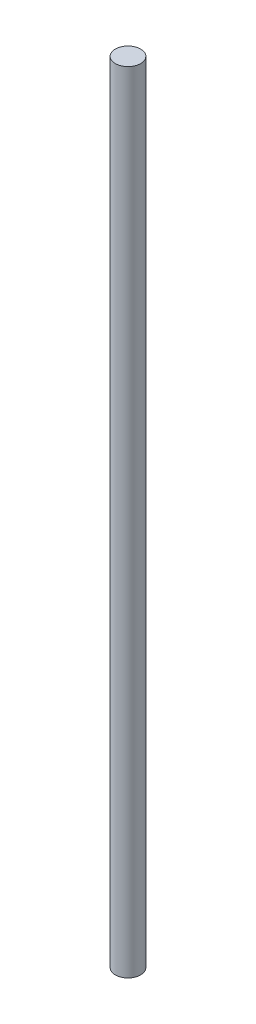
ISO-10303-21;
HEADER;
FILE_DESCRIPTION(('STEP AP214'),'2;1');
FILE_NAME('part.step','',(''),(''),'','','');
FILE_SCHEMA(('AUTOMOTIVE_DESIGN { 1 0 10303 214 1 1 1 1 }'));
ENDSEC;
DATA;
#1=APPLICATION_CONTEXT('core data for automotive mechanical design processes');
#2=APPLICATION_PROTOCOL_DEFINITION('international standard','automotive_design',2000,#1);
#3=PRODUCT_CONTEXT('',#1,'mechanical');
#4=PRODUCT('Part','Part','',(#3));
#5=PRODUCT_RELATED_PRODUCT_CATEGORY('part','',(#4));
#6=PRODUCT_DEFINITION_FORMATION('','',#4);
#7=PRODUCT_DEFINITION_CONTEXT('part definition',#1,'design');
#8=PRODUCT_DEFINITION('design','',#6,#7);
#9=PRODUCT_DEFINITION_SHAPE('','',#8);
#10=(LENGTH_UNIT() NAMED_UNIT(*) SI_UNIT(.MILLI.,.METRE.));
#11=(NAMED_UNIT(*) PLANE_ANGLE_UNIT() SI_UNIT($,.RADIAN.));
#12=(NAMED_UNIT(*) SI_UNIT($,.STERADIAN.) SOLID_ANGLE_UNIT());
#13=UNCERTAINTY_MEASURE_WITH_UNIT(LENGTH_MEASURE(1.E-05),#10,'distance_accuracy_value','');
#14=(GEOMETRIC_REPRESENTATION_CONTEXT(3) GLOBAL_UNCERTAINTY_ASSIGNED_CONTEXT((#13)) GLOBAL_UNIT_ASSIGNED_CONTEXT((#10,
#11,#12)) REPRESENTATION_CONTEXT('',''));
#15=CARTESIAN_POINT('',(0.,0.,0.));
#16=DIRECTION('',(0.,0.,1.));
#17=DIRECTION('',(1.,0.,0.));
#18=AXIS2_PLACEMENT_3D('',#15,#16,#17);
#19=CARTESIAN_POINT('',(0.,25.,0.));
#20=DIRECTION('',(0.,-1.,0.));
#21=DIRECTION('',(0.,0.,-1.));
#22=AXIS2_PLACEMENT_3D('',#19,#20,#21);
#23=CYLINDRICAL_SURFACE('',#22,0.4);
#24=CARTESIAN_POINT('',(0.,25.,0.));
#25=DIRECTION('',(0.,1.,0.));
#26=DIRECTION('',(0.,0.,1.));
#27=AXIS2_PLACEMENT_3D('',#24,#25,#26);
#28=CIRCLE('',#27,0.4);
#29=CARTESIAN_POINT('',(0.,25.,0.4));
#30=VERTEX_POINT('',#29);
#31=EDGE_CURVE('E10',#30,#30,#28,.T.);
#32=ORIENTED_EDGE('',*,*,#31,.F.);
#33=EDGE_LOOP('',(#32));
#34=FACE_BOUND('',#33,.T.);
#35=CARTESIAN_POINT('',(0.,0.,0.));
#36=DIRECTION('',(0.,1.,0.));
#37=DIRECTION('',(0.,0.,1.));
#38=AXIS2_PLACEMENT_3D('',#35,#36,#37);
#39=CIRCLE('',#38,0.4);
#40=CARTESIAN_POINT('',(0.,0.,0.4));
#41=VERTEX_POINT('',#40);
#42=EDGE_CURVE('E40',#41,#41,#39,.T.);
#43=ORIENTED_EDGE('',*,*,#42,.T.);
#44=EDGE_LOOP('',(#43));
#45=FACE_BOUND('',#44,.T.);
#46=ADVANCED_FACE('F37',(#34,#45),#23,.T.);
#47=CARTESIAN_POINT('',(0.,25.,0.));
#48=DIRECTION('',(0.,1.,0.));
#49=DIRECTION('',(0.,0.,1.));
#50=AXIS2_PLACEMENT_3D('',#47,#48,#49);
#51=PLANE('',#50);
#52=ORIENTED_EDGE('',*,*,#31,.T.);
#53=EDGE_LOOP('',(#52));
#54=FACE_BOUND('',#53,.T.);
#55=ADVANCED_FACE('F54',(#54),#51,.T.);
#56=CARTESIAN_POINT('',(0.,0.,0.));
#57=DIRECTION('',(0.,1.,0.));
#58=DIRECTION('',(0.,0.,1.));
#59=AXIS2_PLACEMENT_3D('',#56,#57,#58);
#60=PLANE('',#59);
#61=ORIENTED_EDGE('',*,*,#42,.F.);
#62=EDGE_LOOP('',(#61));
#63=FACE_BOUND('',#62,.T.);
#64=ADVANCED_FACE('F52',(#63),#60,.F.);
#65=CLOSED_SHELL('',(#46,#55,#64));
#66=MANIFOLD_SOLID_BREP('B2',#65);
#67=ADVANCED_BREP_SHAPE_REPRESENTATION('',(#18,#66),#14);
#68=SHAPE_DEFINITION_REPRESENTATION(#9,#67);
ENDSEC;
END-ISO-10303-21;
